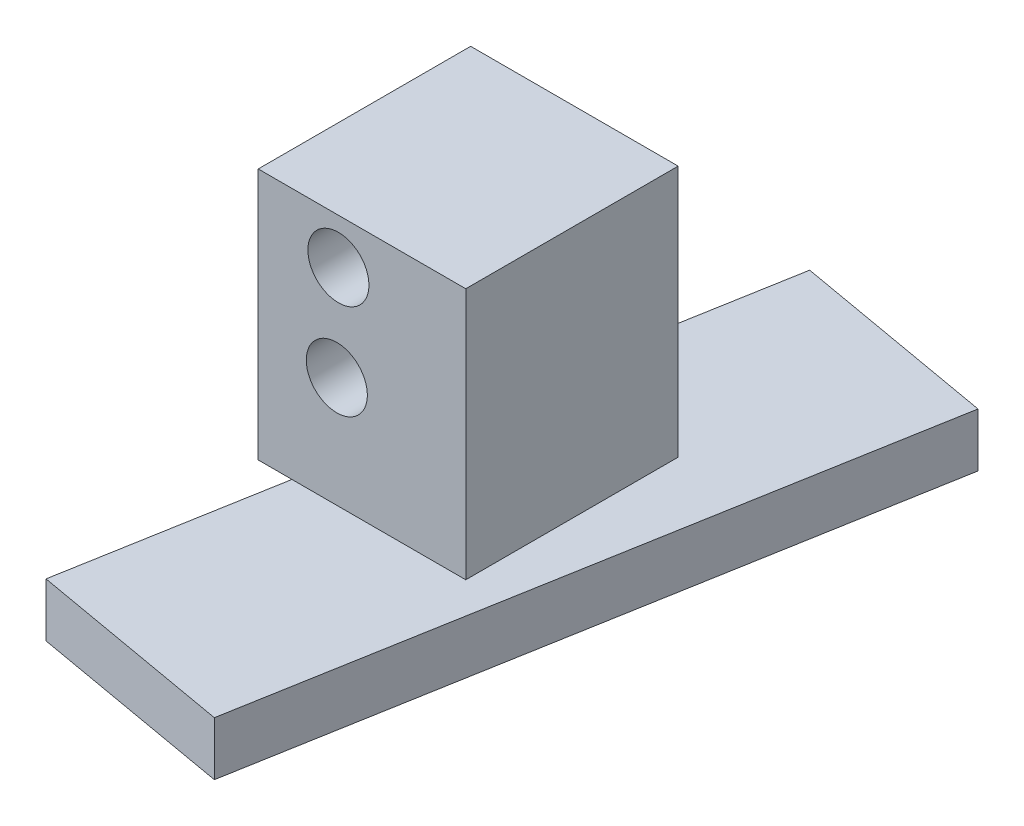
ISO-10303-21;
HEADER;
FILE_DESCRIPTION(('STEP AP214'),'2;1');
FILE_NAME('part.step','',(''),(''),'','','');
FILE_SCHEMA(('AUTOMOTIVE_DESIGN { 1 0 10303 214 1 1 1 1 }'));
ENDSEC;
DATA;
#1=APPLICATION_CONTEXT('core data for automotive mechanical design processes');
#2=APPLICATION_PROTOCOL_DEFINITION('international standard','automotive_design',2000,#1);
#3=PRODUCT_CONTEXT('',#1,'mechanical');
#4=PRODUCT('Part','Part','',(#3));
#5=PRODUCT_RELATED_PRODUCT_CATEGORY('part','',(#4));
#6=PRODUCT_DEFINITION_FORMATION('','',#4);
#7=PRODUCT_DEFINITION_CONTEXT('part definition',#1,'design');
#8=PRODUCT_DEFINITION('design','',#6,#7);
#9=PRODUCT_DEFINITION_SHAPE('','',#8);
#10=(LENGTH_UNIT() NAMED_UNIT(*) SI_UNIT(.MILLI.,.METRE.));
#11=(NAMED_UNIT(*) PLANE_ANGLE_UNIT() SI_UNIT($,.RADIAN.));
#12=(NAMED_UNIT(*) SI_UNIT($,.STERADIAN.) SOLID_ANGLE_UNIT());
#13=UNCERTAINTY_MEASURE_WITH_UNIT(LENGTH_MEASURE(1.E-05),#10,'distance_accuracy_value','');
#14=(GEOMETRIC_REPRESENTATION_CONTEXT(3) GLOBAL_UNCERTAINTY_ASSIGNED_CONTEXT((#13)) GLOBAL_UNIT_ASSIGNED_CONTEXT((#10,
#11,#12)) REPRESENTATION_CONTEXT('',''));
#15=CARTESIAN_POINT('',(0.,0.,0.));
#16=DIRECTION('',(0.,0.,1.));
#17=DIRECTION('',(1.,0.,0.));
#18=AXIS2_PLACEMENT_3D('',#15,#16,#17);
#19=CARTESIAN_POINT('',(450.58022917661,108.990373301079,56.065000365014));
#20=DIRECTION('',(0.,1.,0.));
#21=DIRECTION('',(0.,0.,1.));
#22=AXIS2_PLACEMENT_3D('',#19,#20,#21);
#23=PLANE('',#22);
#24=DIRECTION('',(0.173648177666934,0.,-0.984807753012207));
#25=VECTOR('',#24,1.);
#26=CARTESIAN_POINT('',(428.66273699846,108.990373301079,43.8502512720366));
#27=LINE('',#26,#25);
#28=CARTESIAN_POINT('',(432.49824578887,108.990373301079,22.0979999999999));
#29=VERTEX_POINT('',#28);
#30=CARTESIAN_POINT('',(436.394719408566,108.990373301079,0.));
#31=VERTEX_POINT('',#30);
#32=EDGE_CURVE('E11',#29,#31,#27,.T.);
#33=ORIENTED_EDGE('',*,*,#32,.F.);
#34=DIRECTION('',(-1.,0.,0.));
#35=VECTOR('',#34,1.);
#36=CARTESIAN_POINT('',(450.58022917661,108.990373301079,22.0979999999999));
#37=LINE('',#36,#35);
#38=CARTESIAN_POINT('',(428.99022917661,108.990373301079,22.0979999999999));
#39=VERTEX_POINT('',#38);
#40=EDGE_CURVE('E68',#29,#39,#37,.T.);
#41=ORIENTED_EDGE('',*,*,#40,.T.);
#42=DIRECTION('',(0.,0.,-1.));
#43=VECTOR('',#42,1.);
#44=CARTESIAN_POINT('',(428.99022917661,108.990373301079,56.065000365014));
#45=LINE('',#44,#43);
#46=CARTESIAN_POINT('',(428.99022917661,108.990373301079,0.));
#47=VERTEX_POINT('',#46);
#48=EDGE_CURVE('E89',#39,#47,#45,.T.);
#49=ORIENTED_EDGE('',*,*,#48,.T.);
#50=DIRECTION('',(1.,0.,0.));
#51=VECTOR('',#50,1.);
#52=CARTESIAN_POINT('',(450.58022917661,108.990373301079,0.));
#53=LINE('',#52,#51);
#54=EDGE_CURVE('E91',#47,#31,#53,.T.);
#55=ORIENTED_EDGE('',*,*,#54,.T.);
#56=EDGE_LOOP('',(#33,#41,#49,#55));
#57=FACE_BOUND('',#56,.T.);
#58=ADVANCED_FACE('F45',(#57),#23,.F.);
#59=CARTESIAN_POINT('',(0.,0.,0.));
#60=DIRECTION('',(0.,0.,-1.));
#61=DIRECTION('',(-1.,0.,0.));
#62=AXIS2_PLACEMENT_3D('',#59,#60,#61);
#63=PLANE('',#62);
#64=CARTESIAN_POINT('',(437.331098026262,130.500000000002,0.));
#65=DIRECTION('',(0.,0.,1.));
#66=DIRECTION('',(1.,0.,0.));
#67=AXIS2_PLACEMENT_3D('',#64,#65,#66);
#68=CIRCLE('',#67,3.17500000000009);
#69=CARTESIAN_POINT('',(440.506098026262,130.500000000002,0.));
#70=VERTEX_POINT('',#69);
#71=EDGE_CURVE('E125',#70,#70,#68,.T.);
#72=ORIENTED_EDGE('',*,*,#71,.T.);
#73=EDGE_LOOP('',(#72));
#74=FACE_BOUND('',#73,.T.);
#75=DIRECTION('',(0.,-1.,0.));
#76=VECTOR('',#75,1.);
#77=CARTESIAN_POINT('',(428.99022917661,108.990373301079,0.));
#78=LINE('',#77,#76);
#79=CARTESIAN_POINT('',(428.99022917661,135.213054586502,0.));
#80=VERTEX_POINT('',#79);
#81=EDGE_CURVE('E105',#80,#47,#78,.T.);
#82=ORIENTED_EDGE('',*,*,#81,.F.);
#83=DIRECTION('',(-1.,0.,0.));
#84=VECTOR('',#83,1.);
#85=CARTESIAN_POINT('',(428.99022917661,135.213054586502,0.));
#86=LINE('',#85,#84);
#87=CARTESIAN_POINT('',(450.58022917661,135.213054586502,0.));
#88=VERTEX_POINT('',#87);
#89=EDGE_CURVE('E140',#88,#80,#86,.T.);
#90=ORIENTED_EDGE('',*,*,#89,.F.);
#91=DIRECTION('',(0.,1.,0.));
#92=VECTOR('',#91,1.);
#93=CARTESIAN_POINT('',(450.58022917661,135.213054586502,0.));
#94=LINE('',#93,#92);
#95=CARTESIAN_POINT('',(450.58022917661,108.990373301079,0.));
#96=VERTEX_POINT('',#95);
#97=EDGE_CURVE('E137',#96,#88,#94,.T.);
#98=ORIENTED_EDGE('',*,*,#97,.F.);
#99=EDGE_CURVE('E97',#31,#96,#53,.T.);
#100=ORIENTED_EDGE('',*,*,#99,.F.);
#101=ORIENTED_EDGE('',*,*,#54,.F.);
#102=EDGE_LOOP('',(#82,#90,#98,#100,#101));
#103=FACE_BOUND('',#102,.T.);
#104=CARTESIAN_POINT('',(437.164813365978,120.500000000002,0.));
#105=DIRECTION('',(0.,0.,1.));
#106=DIRECTION('',(1.,0.,0.));
#107=AXIS2_PLACEMENT_3D('',#104,#105,#106);
#108=CIRCLE('',#107,3.17500000000009);
#109=CARTESIAN_POINT('',(440.339813365978,120.500000000002,0.));
#110=VERTEX_POINT('',#109);
#111=EDGE_CURVE('E129',#110,#110,#108,.T.);
#112=ORIENTED_EDGE('',*,*,#111,.T.);
#113=EDGE_LOOP('',(#112));
#114=FACE_BOUND('',#113,.T.);
#115=ADVANCED_FACE('F102',(#74,#103,#114),#63,.T.);
#116=CARTESIAN_POINT('',(428.99022917661,108.990373301079,56.065000365014));
#117=DIRECTION('',(1.,0.,0.));
#118=DIRECTION('',(0.,1.,0.));
#119=AXIS2_PLACEMENT_3D('',#116,#117,#118);
#120=PLANE('',#119);
#121=ORIENTED_EDGE('',*,*,#48,.F.);
#122=DIRECTION('',(0.,1.,0.));
#123=VECTOR('',#122,1.);
#124=CARTESIAN_POINT('',(428.99022917661,108.990373301079,22.0979999999999));
#125=LINE('',#124,#123);
#126=CARTESIAN_POINT('',(428.99022917661,135.213054586502,22.0979999999999));
#127=VERTEX_POINT('',#126);
#128=EDGE_CURVE('E121',#39,#127,#125,.T.);
#129=ORIENTED_EDGE('',*,*,#128,.T.);
#130=DIRECTION('',(0.,0.,-1.));
#131=VECTOR('',#130,1.);
#132=CARTESIAN_POINT('',(428.99022917661,135.213054586502,56.065000365014));
#133=LINE('',#132,#131);
#134=EDGE_CURVE('E114',#127,#80,#133,.T.);
#135=ORIENTED_EDGE('',*,*,#134,.T.);
#136=ORIENTED_EDGE('',*,*,#81,.T.);
#137=EDGE_LOOP('',(#121,#129,#135,#136));
#138=FACE_BOUND('',#137,.T.);
#139=ADVANCED_FACE('F112',(#138),#120,.F.);
#140=CARTESIAN_POINT('',(450.58022917661,135.213054586502,56.065000365014));
#141=DIRECTION('',(-1.,0.,0.));
#142=DIRECTION('',(0.,0.,1.));
#143=AXIS2_PLACEMENT_3D('',#140,#141,#142);
#144=PLANE('',#143);
#145=DIRECTION('',(0.,0.,-1.));
#146=VECTOR('',#145,1.);
#147=CARTESIAN_POINT('',(450.58022917661,135.213054586502,56.065000365014));
#148=LINE('',#147,#146);
#149=CARTESIAN_POINT('',(450.58022917661,135.213054586502,22.0979999999999));
#150=VERTEX_POINT('',#149);
#151=EDGE_CURVE('E138',#150,#88,#148,.T.);
#152=ORIENTED_EDGE('',*,*,#151,.F.);
#153=DIRECTION('',(0.,-1.,0.));
#154=VECTOR('',#153,1.);
#155=CARTESIAN_POINT('',(450.58022917661,135.213054586502,22.0979999999999));
#156=LINE('',#155,#154);
#157=CARTESIAN_POINT('',(450.58022917661,108.990373301079,22.0979999999999));
#158=VERTEX_POINT('',#157);
#159=EDGE_CURVE('E110',#150,#158,#156,.T.);
#160=ORIENTED_EDGE('',*,*,#159,.T.);
#161=DIRECTION('',(0.,0.,-1.));
#162=VECTOR('',#161,1.);
#163=CARTESIAN_POINT('',(450.58022917661,108.990373301079,56.065000365014));
#164=LINE('',#163,#162);
#165=EDGE_CURVE('E134',#158,#96,#164,.T.);
#166=ORIENTED_EDGE('',*,*,#165,.T.);
#167=ORIENTED_EDGE('',*,*,#97,.T.);
#168=EDGE_LOOP('',(#152,#160,#166,#167));
#169=FACE_BOUND('',#168,.T.);
#170=ADVANCED_FACE('F169',(#169),#144,.F.);
#171=CARTESIAN_POINT('',(428.99022917661,135.213054586502,56.065000365014));
#172=DIRECTION('',(0.,-1.,0.));
#173=DIRECTION('',(0.,0.,-1.));
#174=AXIS2_PLACEMENT_3D('',#171,#172,#173);
#175=PLANE('',#174);
#176=ORIENTED_EDGE('',*,*,#134,.F.);
#177=DIRECTION('',(1.,0.,0.));
#178=VECTOR('',#177,1.);
#179=CARTESIAN_POINT('',(428.99022917661,135.213054586502,22.0979999999999));
#180=LINE('',#179,#178);
#181=EDGE_CURVE('E141',#127,#150,#180,.T.);
#182=ORIENTED_EDGE('',*,*,#181,.T.);
#183=ORIENTED_EDGE('',*,*,#151,.T.);
#184=ORIENTED_EDGE('',*,*,#89,.T.);
#185=EDGE_LOOP('',(#176,#182,#183,#184));
#186=FACE_BOUND('',#185,.T.);
#187=ADVANCED_FACE('F258',(#186),#175,.F.);
#188=CARTESIAN_POINT('',(437.331098026262,130.500000000002,56.065000365014));
#189=DIRECTION('',(0.,0.,-1.));
#190=DIRECTION('',(-1.,0.,0.));
#191=AXIS2_PLACEMENT_3D('',#188,#189,#190);
#192=CYLINDRICAL_SURFACE('',#191,3.17500000000009);
#193=CARTESIAN_POINT('',(437.331098026262,130.500000000002,22.0979999999999));
#194=DIRECTION('',(0.,0.,-1.));
#195=DIRECTION('',(-1.,0.,0.));
#196=AXIS2_PLACEMENT_3D('',#193,#194,#195);
#197=CIRCLE('',#196,3.17500000000009);
#198=CARTESIAN_POINT('',(434.156098026262,130.500000000002,22.0979999999999));
#199=VERTEX_POINT('',#198);
#200=EDGE_CURVE('E55',#199,#199,#197,.T.);
#201=ORIENTED_EDGE('',*,*,#200,.F.);
#202=EDGE_LOOP('',(#201));
#203=FACE_BOUND('',#202,.T.);
#204=ORIENTED_EDGE('',*,*,#71,.F.);
#205=EDGE_LOOP('',(#204));
#206=FACE_BOUND('',#205,.T.);
#207=ADVANCED_FACE('F260',(#203,#206),#192,.F.);
#208=CARTESIAN_POINT('',(437.164813365978,120.500000000002,56.065000365014));
#209=DIRECTION('',(0.,0.,-1.));
#210=DIRECTION('',(-1.,0.,0.));
#211=AXIS2_PLACEMENT_3D('',#208,#209,#210);
#212=CYLINDRICAL_SURFACE('',#211,3.17500000000009);
#213=CARTESIAN_POINT('',(437.164813365978,120.500000000002,22.0979999999999));
#214=DIRECTION('',(0.,0.,-1.));
#215=DIRECTION('',(-1.,0.,0.));
#216=AXIS2_PLACEMENT_3D('',#213,#214,#215);
#217=CIRCLE('',#216,3.17500000000009);
#218=CARTESIAN_POINT('',(433.989813365978,120.500000000002,22.0979999999999));
#219=VERTEX_POINT('',#218);
#220=EDGE_CURVE('E49',#219,#219,#217,.T.);
#221=ORIENTED_EDGE('',*,*,#220,.F.);
#222=EDGE_LOOP('',(#221));
#223=FACE_BOUND('',#222,.T.);
#224=ORIENTED_EDGE('',*,*,#111,.F.);
#225=EDGE_LOOP('',(#224));
#226=FACE_BOUND('',#225,.T.);
#227=ADVANCED_FACE('F266',(#223,#226),#212,.F.);
#228=CARTESIAN_POINT('',(405.578410842197,135.602357212337,22.0979999999999));
#229=DIRECTION('',(0.,0.,-1.));
#230=DIRECTION('',(1.,0.,0.));
#231=AXIS2_PLACEMENT_3D('',#228,#229,#230);
#232=PLANE('',#231);
#233=ORIENTED_EDGE('',*,*,#220,.T.);
#234=EDGE_LOOP('',(#233));
#235=FACE_BOUND('',#234,.T.);
#236=ORIENTED_EDGE('',*,*,#200,.T.);
#237=EDGE_LOOP('',(#236));
#238=FACE_BOUND('',#237,.T.);
#239=EDGE_CURVE('E98',#158,#29,#37,.T.);
#240=ORIENTED_EDGE('',*,*,#239,.F.);
#241=ORIENTED_EDGE('',*,*,#159,.F.);
#242=ORIENTED_EDGE('',*,*,#181,.F.);
#243=ORIENTED_EDGE('',*,*,#128,.F.);
#244=ORIENTED_EDGE('',*,*,#40,.F.);
#245=EDGE_LOOP('',(#240,#241,#242,#243,#244));
#246=FACE_BOUND('',#245,.T.);
#247=ADVANCED_FACE('F47',(#235,#238,#246),#232,.F.);
#248=CARTESIAN_POINT('',(0.,108.990373301079,-2.29366658560221E-13));
#249=DIRECTION('',(0.,-1.,0.));
#250=DIRECTION('',(0.,0.,-1.));
#251=AXIS2_PLACEMENT_3D('',#248,#249,#250);
#252=PLANE('',#251);
#253=ORIENTED_EDGE('',*,*,#165,.F.);
#254=ORIENTED_EDGE('',*,*,#239,.T.);
#255=CARTESIAN_POINT('',(428.66273699846,108.990373301079,43.8502512720366));
#256=VERTEX_POINT('',#255);
#257=EDGE_CURVE('E57',#256,#29,#27,.T.);
#258=ORIENTED_EDGE('',*,*,#257,.F.);
#259=DIRECTION('',(-0.984807753012207,0.,-0.173648177666934));
#260=VECTOR('',#259,1.);
#261=CARTESIAN_POINT('',(449.924736385994,108.990373301079,47.5993154278657));
#262=LINE('',#261,#260);
#263=CARTESIAN_POINT('',(449.924736385994,108.990373301079,47.5993154278657));
#264=VERTEX_POINT('',#263);
#265=EDGE_CURVE('E186',#264,#256,#262,.T.);
#266=ORIENTED_EDGE('',*,*,#265,.F.);
#267=DIRECTION('',(-0.173648177666934,0.,0.984807753012207));
#268=VECTOR('',#267,1.);
#269=CARTESIAN_POINT('',(461.833528410392,108.990373301079,-19.9388002737115));
#270=LINE('',#269,#268);
#271=CARTESIAN_POINT('',(461.833528410392,108.990373301079,-19.9388002737115));
#272=VERTEX_POINT('',#271);
#273=EDGE_CURVE('E227',#272,#264,#270,.T.);
#274=ORIENTED_EDGE('',*,*,#273,.F.);
#275=DIRECTION('',(0.984807753012207,0.,0.173648177666934));
#276=VECTOR('',#275,1.);
#277=CARTESIAN_POINT('',(440.571529022858,108.990373301079,-23.6878644295406));
#278=LINE('',#277,#276);
#279=CARTESIAN_POINT('',(440.571529022858,108.990373301079,-23.6878644295406));
#280=VERTEX_POINT('',#279);
#281=EDGE_CURVE('E179',#280,#272,#278,.T.);
#282=ORIENTED_EDGE('',*,*,#281,.F.);
#283=EDGE_CURVE('E58',#31,#280,#27,.T.);
#284=ORIENTED_EDGE('',*,*,#283,.F.);
#285=ORIENTED_EDGE('',*,*,#99,.T.);
#286=EDGE_LOOP('',(#253,#254,#258,#266,#274,#282,#284,#285));
#287=FACE_BOUND('',#286,.T.);
#288=ADVANCED_FACE('F172',(#287),#252,.F.);
#289=CARTESIAN_POINT('',(461.833528410392,103.402373301079,-19.9388002737115));
#290=DIRECTION('',(-0.984807753012208,0.,-0.173648177666934));
#291=DIRECTION('',(-0.173648177666934,0.,0.984807753012208));
#292=AXIS2_PLACEMENT_3D('',#289,#290,#291);
#293=PLANE('',#292);
#294=ORIENTED_EDGE('',*,*,#273,.T.);
#295=DIRECTION('',(0.,1.,0.));
#296=VECTOR('',#295,1.);
#297=CARTESIAN_POINT('',(449.924736385994,103.402373301079,47.5993154278657));
#298=LINE('',#297,#296);
#299=CARTESIAN_POINT('',(449.924736385994,103.402373301079,47.5993154278657));
#300=VERTEX_POINT('',#299);
#301=EDGE_CURVE('E130',#300,#264,#298,.T.);
#302=ORIENTED_EDGE('',*,*,#301,.F.);
#303=DIRECTION('',(-0.173648177666934,0.,0.984807753012207));
#304=VECTOR('',#303,1.);
#305=CARTESIAN_POINT('',(461.833528410392,103.402373301079,-19.9388002737115));
#306=LINE('',#305,#304);
#307=CARTESIAN_POINT('',(461.833528410392,103.402373301079,-19.9388002737115));
#308=VERTEX_POINT('',#307);
#309=EDGE_CURVE('E198',#308,#300,#306,.T.);
#310=ORIENTED_EDGE('',*,*,#309,.F.);
#311=DIRECTION('',(0.,1.,0.));
#312=VECTOR('',#311,1.);
#313=CARTESIAN_POINT('',(461.833528410392,103.402373301079,-19.9388002737115));
#314=LINE('',#313,#312);
#315=EDGE_CURVE('E203',#308,#272,#314,.T.);
#316=ORIENTED_EDGE('',*,*,#315,.T.);
#317=EDGE_LOOP('',(#294,#302,#310,#316));
#318=FACE_BOUND('',#317,.T.);
#319=ADVANCED_FACE('F228',(#318),#293,.F.);
#320=CARTESIAN_POINT('',(449.924736385994,103.402373301079,47.5993154278657));
#321=DIRECTION('',(0.173648177666934,0.,-0.984807753012208));
#322=DIRECTION('',(-0.984807753012208,0.,-0.173648177666934));
#323=AXIS2_PLACEMENT_3D('',#320,#321,#322);
#324=PLANE('',#323);
#325=ORIENTED_EDGE('',*,*,#265,.T.);
#326=DIRECTION('',(0.,1.,0.));
#327=VECTOR('',#326,1.);
#328=CARTESIAN_POINT('',(428.66273699846,103.402373301079,43.8502512720366));
#329=LINE('',#328,#327);
#330=CARTESIAN_POINT('',(428.66273699846,103.402373301079,43.8502512720366));
#331=VERTEX_POINT('',#330);
#332=EDGE_CURVE('E194',#331,#256,#329,.T.);
#333=ORIENTED_EDGE('',*,*,#332,.F.);
#334=DIRECTION('',(-0.984807753012207,0.,-0.173648177666934));
#335=VECTOR('',#334,1.);
#336=CARTESIAN_POINT('',(449.924736385994,103.402373301079,47.5993154278657));
#337=LINE('',#336,#335);
#338=EDGE_CURVE('E222',#300,#331,#337,.T.);
#339=ORIENTED_EDGE('',*,*,#338,.F.);
#340=ORIENTED_EDGE('',*,*,#301,.T.);
#341=EDGE_LOOP('',(#325,#333,#339,#340));
#342=FACE_BOUND('',#341,.T.);
#343=ADVANCED_FACE('F219',(#342),#324,.F.);
#344=CARTESIAN_POINT('',(428.66273699846,103.402373301079,43.8502512720366));
#345=DIRECTION('',(0.984807753012208,0.,0.173648177666934));
#346=DIRECTION('',(0.173648177666934,0.,-0.984807753012208));
#347=AXIS2_PLACEMENT_3D('',#344,#345,#346);
#348=PLANE('',#347);
#349=ORIENTED_EDGE('',*,*,#257,.T.);
#350=ORIENTED_EDGE('',*,*,#32,.T.);
#351=ORIENTED_EDGE('',*,*,#283,.T.);
#352=DIRECTION('',(0.,1.,0.));
#353=VECTOR('',#352,1.);
#354=CARTESIAN_POINT('',(440.571529022858,103.402373301079,-23.6878644295406));
#355=LINE('',#354,#353);
#356=CARTESIAN_POINT('',(440.571529022858,103.402373301079,-23.6878644295406));
#357=VERTEX_POINT('',#356);
#358=EDGE_CURVE('E207',#357,#280,#355,.T.);
#359=ORIENTED_EDGE('',*,*,#358,.F.);
#360=DIRECTION('',(0.173648177666934,0.,-0.984807753012207));
#361=VECTOR('',#360,1.);
#362=CARTESIAN_POINT('',(428.66273699846,103.402373301079,43.8502512720366));
#363=LINE('',#362,#361);
#364=EDGE_CURVE('E237',#331,#357,#363,.T.);
#365=ORIENTED_EDGE('',*,*,#364,.F.);
#366=ORIENTED_EDGE('',*,*,#332,.T.);
#367=EDGE_LOOP('',(#349,#350,#351,#359,#365,#366));
#368=FACE_BOUND('',#367,.T.);
#369=ADVANCED_FACE('F188',(#368),#348,.F.);
#370=CARTESIAN_POINT('',(440.571529022858,103.402373301079,-23.6878644295406));
#371=DIRECTION('',(-0.173648177666934,0.,0.984807753012208));
#372=DIRECTION('',(0.984807753012208,0.,0.173648177666934));
#373=AXIS2_PLACEMENT_3D('',#370,#371,#372);
#374=PLANE('',#373);
#375=ORIENTED_EDGE('',*,*,#281,.T.);
#376=ORIENTED_EDGE('',*,*,#315,.F.);
#377=DIRECTION('',(0.984807753012207,0.,0.173648177666934));
#378=VECTOR('',#377,1.);
#379=CARTESIAN_POINT('',(440.571529022858,103.402373301079,-23.6878644295406));
#380=LINE('',#379,#378);
#381=EDGE_CURVE('E208',#357,#308,#380,.T.);
#382=ORIENTED_EDGE('',*,*,#381,.F.);
#383=ORIENTED_EDGE('',*,*,#358,.T.);
#384=EDGE_LOOP('',(#375,#376,#382,#383));
#385=FACE_BOUND('',#384,.T.);
#386=ADVANCED_FACE('F296',(#385),#374,.F.);
#387=CARTESIAN_POINT('',(0.,103.402373301079,-2.17355223715981E-13));
#388=DIRECTION('',(0.,-1.,0.));
#389=DIRECTION('',(0.,0.,-1.));
#390=AXIS2_PLACEMENT_3D('',#387,#388,#389);
#391=PLANE('',#390);
#392=ORIENTED_EDGE('',*,*,#309,.T.);
#393=ORIENTED_EDGE('',*,*,#338,.T.);
#394=ORIENTED_EDGE('',*,*,#364,.T.);
#395=ORIENTED_EDGE('',*,*,#381,.T.);
#396=EDGE_LOOP('',(#392,#393,#394,#395));
#397=FACE_BOUND('',#396,.T.);
#398=ADVANCED_FACE('F245',(#397),#391,.T.);
#399=CLOSED_SHELL('',(#58,#115,#139,#170,#187,#207,#227,#247,#288,#319,#343,#369,#386,#398));
#400=MANIFOLD_SOLID_BREP('B2',#399);
#401=ADVANCED_BREP_SHAPE_REPRESENTATION('',(#18,#400),#14);
#402=SHAPE_DEFINITION_REPRESENTATION(#9,#401);
ENDSEC;
END-ISO-10303-21;
